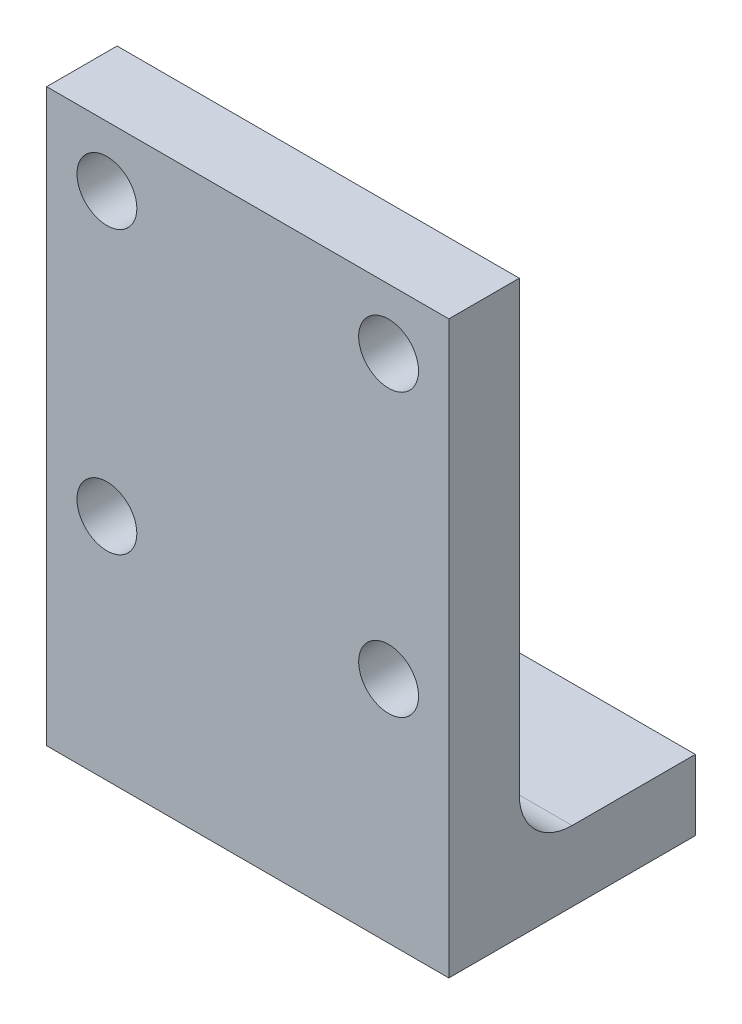
ISO-10303-21;
HEADER;
FILE_DESCRIPTION(('STEP AP214'),'2;1');
FILE_NAME('part.step','',(''),(''),'','','');
FILE_SCHEMA(('AUTOMOTIVE_DESIGN { 1 0 10303 214 1 1 1 1 }'));
ENDSEC;
DATA;
#1=APPLICATION_CONTEXT('core data for automotive mechanical design processes');
#2=APPLICATION_PROTOCOL_DEFINITION('international standard','automotive_design',2000,#1);
#3=PRODUCT_CONTEXT('',#1,'mechanical');
#4=PRODUCT('Part','Part','',(#3));
#5=PRODUCT_RELATED_PRODUCT_CATEGORY('part','',(#4));
#6=PRODUCT_DEFINITION_FORMATION('','',#4);
#7=PRODUCT_DEFINITION_CONTEXT('part definition',#1,'design');
#8=PRODUCT_DEFINITION('design','',#6,#7);
#9=PRODUCT_DEFINITION_SHAPE('','',#8);
#10=(LENGTH_UNIT() NAMED_UNIT(*) SI_UNIT(.MILLI.,.METRE.));
#11=(NAMED_UNIT(*) PLANE_ANGLE_UNIT() SI_UNIT($,.RADIAN.));
#12=(NAMED_UNIT(*) SI_UNIT($,.STERADIAN.) SOLID_ANGLE_UNIT());
#13=UNCERTAINTY_MEASURE_WITH_UNIT(LENGTH_MEASURE(1.E-05),#10,'distance_accuracy_value','');
#14=(GEOMETRIC_REPRESENTATION_CONTEXT(3) GLOBAL_UNCERTAINTY_ASSIGNED_CONTEXT((#13)) GLOBAL_UNIT_ASSIGNED_CONTEXT((#10,
#11,#12)) REPRESENTATION_CONTEXT('',''));
#15=CARTESIAN_POINT('',(0.,0.,0.));
#16=DIRECTION('',(0.,0.,1.));
#17=DIRECTION('',(1.,0.,0.));
#18=AXIS2_PLACEMENT_3D('',#15,#16,#17);
#19=CARTESIAN_POINT('',(0.,0.,0.));
#20=DIRECTION('',(0.,0.,1.));
#21=DIRECTION('',(1.,0.,0.));
#22=AXIS2_PLACEMENT_3D('',#19,#20,#21);
#23=PLANE('',#22);
#24=CARTESIAN_POINT('',(-8.,-8.00000000000001,0.));
#25=DIRECTION('',(0.,0.,1.));
#26=DIRECTION('',(1.,0.,0.));
#27=AXIS2_PLACEMENT_3D('',#24,#25,#26);
#28=CIRCLE('',#27,1.7);
#29=CARTESIAN_POINT('',(-6.3,-8.00000000000001,0.));
#30=VERTEX_POINT('',#29);
#31=EDGE_CURVE('E127',#30,#30,#28,.T.);
#32=ORIENTED_EDGE('',*,*,#31,.T.);
#33=EDGE_LOOP('',(#32));
#34=FACE_BOUND('',#33,.T.);
#35=CARTESIAN_POINT('',(8.00000000000001,-8.00000000000001,0.));
#36=DIRECTION('',(0.,0.,1.));
#37=DIRECTION('',(1.,0.,0.));
#38=AXIS2_PLACEMENT_3D('',#35,#36,#37);
#39=CIRCLE('',#38,1.7);
#40=CARTESIAN_POINT('',(9.70000000000001,-8.00000000000001,0.));
#41=VERTEX_POINT('',#40);
#42=EDGE_CURVE('E131',#41,#41,#39,.T.);
#43=ORIENTED_EDGE('',*,*,#42,.T.);
#44=EDGE_LOOP('',(#43));
#45=FACE_BOUND('',#44,.T.);
#46=CARTESIAN_POINT('',(8.,7.99999999999999,0.));
#47=DIRECTION('',(0.,0.,1.));
#48=DIRECTION('',(1.,0.,0.));
#49=AXIS2_PLACEMENT_3D('',#46,#47,#48);
#50=CIRCLE('',#49,1.7);
#51=CARTESIAN_POINT('',(9.7,7.99999999999999,0.));
#52=VERTEX_POINT('',#51);
#53=EDGE_CURVE('E137',#52,#52,#50,.T.);
#54=ORIENTED_EDGE('',*,*,#53,.T.);
#55=EDGE_LOOP('',(#54));
#56=FACE_BOUND('',#55,.T.);
#57=CARTESIAN_POINT('',(-8.,7.99999999999999,0.));
#58=DIRECTION('',(0.,0.,1.));
#59=DIRECTION('',(1.,0.,0.));
#60=AXIS2_PLACEMENT_3D('',#57,#58,#59);
#61=CIRCLE('',#60,1.7);
#62=CARTESIAN_POINT('',(-6.3,7.99999999999999,0.));
#63=VERTEX_POINT('',#62);
#64=EDGE_CURVE('E143',#63,#63,#61,.T.);
#65=ORIENTED_EDGE('',*,*,#64,.T.);
#66=EDGE_LOOP('',(#65));
#67=FACE_BOUND('',#66,.T.);
#68=DIRECTION('',(0.,1.,0.));
#69=VECTOR('',#68,1.);
#70=CARTESIAN_POINT('',(11.4218621245284,11.4218621245284,0.));
#71=LINE('',#70,#69);
#72=CARTESIAN_POINT('',(11.4218621245284,-14.,0.));
#73=VERTEX_POINT('',#72);
#74=CARTESIAN_POINT('',(11.4218621245284,11.4218621245284,0.));
#75=VERTEX_POINT('',#74);
#76=EDGE_CURVE('E149',#73,#75,#71,.T.);
#77=ORIENTED_EDGE('',*,*,#76,.F.);
#78=DIRECTION('',(1.,0.,0.));
#79=VECTOR('',#78,1.);
#80=CARTESIAN_POINT('',(-11.4218621245284,-14.,0.));
#81=LINE('',#80,#79);
#82=CARTESIAN_POINT('',(-11.4218621245284,-14.,0.));
#83=VERTEX_POINT('',#82);
#84=EDGE_CURVE('E54',#73,#83,#81,.F.);
#85=ORIENTED_EDGE('',*,*,#84,.T.);
#86=DIRECTION('',(0.,-1.,0.));
#87=VECTOR('',#86,1.);
#88=CARTESIAN_POINT('',(-11.4218621245284,11.4218621245284,0.));
#89=LINE('',#88,#87);
#90=CARTESIAN_POINT('',(-11.4218621245284,11.4218621245284,0.));
#91=VERTEX_POINT('',#90);
#92=EDGE_CURVE('E154',#91,#83,#89,.T.);
#93=ORIENTED_EDGE('',*,*,#92,.F.);
#94=DIRECTION('',(-1.,0.,0.));
#95=VECTOR('',#94,1.);
#96=CARTESIAN_POINT('',(-11.4218621245284,11.4218621245284,0.));
#97=LINE('',#96,#95);
#98=EDGE_CURVE('E160',#75,#91,#97,.T.);
#99=ORIENTED_EDGE('',*,*,#98,.F.);
#100=EDGE_LOOP('',(#77,#85,#93,#99));
#101=FACE_BOUND('',#100,.T.);
#102=ADVANCED_FACE('F33',(#34,#45,#56,#67,#101),#23,.F.);
#103=CARTESIAN_POINT('',(0.,0.,4.));
#104=DIRECTION('',(0.,0.,1.));
#105=DIRECTION('',(1.,0.,0.));
#106=AXIS2_PLACEMENT_3D('',#103,#104,#105);
#107=PLANE('',#106);
#108=CARTESIAN_POINT('',(8.00000000000001,-8.00000000000001,4.));
#109=DIRECTION('',(0.,0.,1.));
#110=DIRECTION('',(1.,0.,0.));
#111=AXIS2_PLACEMENT_3D('',#108,#109,#110);
#112=CIRCLE('',#111,1.7);
#113=CARTESIAN_POINT('',(9.70000000000001,-8.00000000000001,4.));
#114=VERTEX_POINT('',#113);
#115=EDGE_CURVE('E134',#114,#114,#112,.T.);
#116=ORIENTED_EDGE('',*,*,#115,.F.);
#117=EDGE_LOOP('',(#116));
#118=FACE_BOUND('',#117,.T.);
#119=CARTESIAN_POINT('',(-8.,7.99999999999999,4.));
#120=DIRECTION('',(0.,0.,1.));
#121=DIRECTION('',(1.,0.,0.));
#122=AXIS2_PLACEMENT_3D('',#119,#120,#121);
#123=CIRCLE('',#122,1.7);
#124=CARTESIAN_POINT('',(-6.3,7.99999999999999,4.));
#125=VERTEX_POINT('',#124);
#126=EDGE_CURVE('E146',#125,#125,#123,.T.);
#127=ORIENTED_EDGE('',*,*,#126,.F.);
#128=EDGE_LOOP('',(#127));
#129=FACE_BOUND('',#128,.T.);
#130=DIRECTION('',(0.,1.,0.));
#131=VECTOR('',#130,1.);
#132=CARTESIAN_POINT('',(11.4218621245284,11.4218621245284,4.));
#133=LINE('',#132,#131);
#134=CARTESIAN_POINT('',(11.4218621245284,-21.,4.));
#135=VERTEX_POINT('',#134);
#136=CARTESIAN_POINT('',(11.4218621245284,11.4218621245284,4.));
#137=VERTEX_POINT('',#136);
#138=EDGE_CURVE('E97',#135,#137,#133,.T.);
#139=ORIENTED_EDGE('',*,*,#138,.T.);
#140=DIRECTION('',(-1.,0.,0.));
#141=VECTOR('',#140,1.);
#142=CARTESIAN_POINT('',(-11.4218621245284,11.4218621245284,4.));
#143=LINE('',#142,#141);
#144=CARTESIAN_POINT('',(-11.4218621245284,11.4218621245284,4.));
#145=VERTEX_POINT('',#144);
#146=EDGE_CURVE('E153',#137,#145,#143,.T.);
#147=ORIENTED_EDGE('',*,*,#146,.T.);
#148=DIRECTION('',(0.,-1.,0.));
#149=VECTOR('',#148,1.);
#150=CARTESIAN_POINT('',(-11.4218621245284,11.4218621245284,4.));
#151=LINE('',#150,#149);
#152=CARTESIAN_POINT('',(-11.4218621245284,-21.,4.));
#153=VERTEX_POINT('',#152);
#154=EDGE_CURVE('E156',#145,#153,#151,.T.);
#155=ORIENTED_EDGE('',*,*,#154,.T.);
#156=DIRECTION('',(1.,0.,0.));
#157=VECTOR('',#156,1.);
#158=CARTESIAN_POINT('',(-11.4218621245284,-21.,4.));
#159=LINE('',#158,#157);
#160=EDGE_CURVE('E102',#153,#135,#159,.T.);
#161=ORIENTED_EDGE('',*,*,#160,.T.);
#162=EDGE_LOOP('',(#139,#147,#155,#161));
#163=FACE_BOUND('',#162,.T.);
#164=CARTESIAN_POINT('',(8.,7.99999999999999,4.));
#165=DIRECTION('',(0.,0.,1.));
#166=DIRECTION('',(1.,0.,0.));
#167=AXIS2_PLACEMENT_3D('',#164,#165,#166);
#168=CIRCLE('',#167,1.7);
#169=CARTESIAN_POINT('',(9.7,7.99999999999999,4.));
#170=VERTEX_POINT('',#169);
#171=EDGE_CURVE('E140',#170,#170,#168,.T.);
#172=ORIENTED_EDGE('',*,*,#171,.F.);
#173=EDGE_LOOP('',(#172));
#174=FACE_BOUND('',#173,.T.);
#175=CARTESIAN_POINT('',(-8.,-8.00000000000001,4.));
#176=DIRECTION('',(0.,0.,1.));
#177=DIRECTION('',(1.,0.,0.));
#178=AXIS2_PLACEMENT_3D('',#175,#176,#177);
#179=CIRCLE('',#178,1.7);
#180=CARTESIAN_POINT('',(-6.3,-8.00000000000001,4.));
#181=VERTEX_POINT('',#180);
#182=EDGE_CURVE('E128',#181,#181,#179,.T.);
#183=ORIENTED_EDGE('',*,*,#182,.F.);
#184=EDGE_LOOP('',(#183));
#185=FACE_BOUND('',#184,.T.);
#186=ADVANCED_FACE('F185',(#118,#129,#163,#174,#185),#107,.T.);
#187=CARTESIAN_POINT('',(11.4218621245284,11.4218621245284,4.));
#188=DIRECTION('',(-1.,0.,0.));
#189=DIRECTION('',(0.,-1.,0.));
#190=AXIS2_PLACEMENT_3D('',#187,#188,#189);
#191=PLANE('',#190);
#192=DIRECTION('',(0.,0.,-1.));
#193=VECTOR('',#192,1.);
#194=CARTESIAN_POINT('',(11.4218621245284,-21.,4.));
#195=LINE('',#194,#193);
#196=CARTESIAN_POINT('',(11.4218621245284,-21.,-10.));
#197=VERTEX_POINT('',#196);
#198=EDGE_CURVE('E90',#135,#197,#195,.T.);
#199=ORIENTED_EDGE('',*,*,#198,.T.);
#200=DIRECTION('',(0.,-1.,0.));
#201=VECTOR('',#200,1.);
#202=CARTESIAN_POINT('',(11.4218621245284,-21.,-10.));
#203=LINE('',#202,#201);
#204=CARTESIAN_POINT('',(11.4218621245284,-17.,-10.));
#205=VERTEX_POINT('',#204);
#206=EDGE_CURVE('E94',#205,#197,#203,.T.);
#207=ORIENTED_EDGE('',*,*,#206,.F.);
#208=DIRECTION('',(0.,0.,1.));
#209=VECTOR('',#208,1.);
#210=CARTESIAN_POINT('',(11.4218621245284,-17.,-10.));
#211=LINE('',#210,#209);
#212=CARTESIAN_POINT('',(11.4218621245284,-17.,-3.));
#213=VERTEX_POINT('',#212);
#214=EDGE_CURVE('E120',#205,#213,#211,.T.);
#215=ORIENTED_EDGE('',*,*,#214,.T.);
#216=CARTESIAN_POINT('',(11.4218621245284,-14.,-3.));
#217=DIRECTION('',(-1.,0.,0.));
#218=DIRECTION('',(0.,-1.,0.));
#219=AXIS2_PLACEMENT_3D('',#216,#217,#218);
#220=CIRCLE('',#219,3.);
#221=EDGE_CURVE('E41',#213,#73,#220,.T.);
#222=ORIENTED_EDGE('',*,*,#221,.T.);
#223=ORIENTED_EDGE('',*,*,#76,.T.);
#224=DIRECTION('',(0.,0.,-1.));
#225=VECTOR('',#224,1.);
#226=CARTESIAN_POINT('',(11.4218621245284,11.4218621245284,4.));
#227=LINE('',#226,#225);
#228=EDGE_CURVE('E165',#137,#75,#227,.T.);
#229=ORIENTED_EDGE('',*,*,#228,.F.);
#230=ORIENTED_EDGE('',*,*,#138,.F.);
#231=EDGE_LOOP('',(#199,#207,#215,#222,#223,#229,#230));
#232=FACE_BOUND('',#231,.T.);
#233=ADVANCED_FACE('F92',(#232),#191,.F.);
#234=CARTESIAN_POINT('',(-11.4218621245284,11.4218621245284,4.));
#235=DIRECTION('',(0.,-1.,0.));
#236=DIRECTION('',(0.,0.,-1.));
#237=AXIS2_PLACEMENT_3D('',#234,#235,#236);
#238=PLANE('',#237);
#239=ORIENTED_EDGE('',*,*,#98,.T.);
#240=DIRECTION('',(0.,0.,-1.));
#241=VECTOR('',#240,1.);
#242=CARTESIAN_POINT('',(-11.4218621245284,11.4218621245284,4.));
#243=LINE('',#242,#241);
#244=EDGE_CURVE('E158',#145,#91,#243,.T.);
#245=ORIENTED_EDGE('',*,*,#244,.F.);
#246=ORIENTED_EDGE('',*,*,#146,.F.);
#247=ORIENTED_EDGE('',*,*,#228,.T.);
#248=EDGE_LOOP('',(#239,#245,#246,#247));
#249=FACE_BOUND('',#248,.T.);
#250=ADVANCED_FACE('F183',(#249),#238,.F.);
#251=CARTESIAN_POINT('',(-11.4218621245284,11.4218621245284,4.));
#252=DIRECTION('',(1.,0.,0.));
#253=DIRECTION('',(0.,1.,0.));
#254=AXIS2_PLACEMENT_3D('',#251,#252,#253);
#255=PLANE('',#254);
#256=ORIENTED_EDGE('',*,*,#92,.T.);
#257=CARTESIAN_POINT('',(-11.4218621245284,-14.,-3.));
#258=DIRECTION('',(1.,0.,0.));
#259=DIRECTION('',(0.,1.,0.));
#260=AXIS2_PLACEMENT_3D('',#257,#258,#259);
#261=CIRCLE('',#260,3.);
#262=CARTESIAN_POINT('',(-11.4218621245284,-17.,-3.));
#263=VERTEX_POINT('',#262);
#264=EDGE_CURVE('E11',#83,#263,#261,.T.);
#265=ORIENTED_EDGE('',*,*,#264,.T.);
#266=DIRECTION('',(0.,0.,1.));
#267=VECTOR('',#266,1.);
#268=CARTESIAN_POINT('',(-11.4218621245284,-17.,-10.));
#269=LINE('',#268,#267);
#270=CARTESIAN_POINT('',(-11.4218621245284,-17.,-10.));
#271=VERTEX_POINT('',#270);
#272=EDGE_CURVE('E122',#271,#263,#269,.T.);
#273=ORIENTED_EDGE('',*,*,#272,.F.);
#274=DIRECTION('',(0.,1.,0.));
#275=VECTOR('',#274,1.);
#276=CARTESIAN_POINT('',(-11.4218621245284,-21.,-10.));
#277=LINE('',#276,#275);
#278=CARTESIAN_POINT('',(-11.4218621245284,-21.,-10.));
#279=VERTEX_POINT('',#278);
#280=EDGE_CURVE('E110',#279,#271,#277,.T.);
#281=ORIENTED_EDGE('',*,*,#280,.F.);
#282=DIRECTION('',(0.,0.,-1.));
#283=VECTOR('',#282,1.);
#284=CARTESIAN_POINT('',(-11.4218621245284,-21.,4.));
#285=LINE('',#284,#283);
#286=EDGE_CURVE('E101',#153,#279,#285,.T.);
#287=ORIENTED_EDGE('',*,*,#286,.F.);
#288=ORIENTED_EDGE('',*,*,#154,.F.);
#289=ORIENTED_EDGE('',*,*,#244,.T.);
#290=EDGE_LOOP('',(#256,#265,#273,#281,#287,#288,#289));
#291=FACE_BOUND('',#290,.T.);
#292=ADVANCED_FACE('F178',(#291),#255,.F.);
#293=CARTESIAN_POINT('',(-8.,7.99999999999999,4.));
#294=DIRECTION('',(0.,0.,-1.));
#295=DIRECTION('',(-1.,0.,0.));
#296=AXIS2_PLACEMENT_3D('',#293,#294,#295);
#297=CYLINDRICAL_SURFACE('',#296,1.7);
#298=ORIENTED_EDGE('',*,*,#126,.T.);
#299=EDGE_LOOP('',(#298));
#300=FACE_BOUND('',#299,.T.);
#301=ORIENTED_EDGE('',*,*,#64,.F.);
#302=EDGE_LOOP('',(#301));
#303=FACE_BOUND('',#302,.T.);
#304=ADVANCED_FACE('F210',(#300,#303),#297,.F.);
#305=CARTESIAN_POINT('',(8.,7.99999999999999,4.));
#306=DIRECTION('',(0.,0.,-1.));
#307=DIRECTION('',(-1.,0.,0.));
#308=AXIS2_PLACEMENT_3D('',#305,#306,#307);
#309=CYLINDRICAL_SURFACE('',#308,1.7);
#310=ORIENTED_EDGE('',*,*,#171,.T.);
#311=EDGE_LOOP('',(#310));
#312=FACE_BOUND('',#311,.T.);
#313=ORIENTED_EDGE('',*,*,#53,.F.);
#314=EDGE_LOOP('',(#313));
#315=FACE_BOUND('',#314,.T.);
#316=ADVANCED_FACE('F212',(#312,#315),#309,.F.);
#317=CARTESIAN_POINT('',(8.00000000000001,-8.00000000000001,4.));
#318=DIRECTION('',(0.,0.,-1.));
#319=DIRECTION('',(-1.,0.,0.));
#320=AXIS2_PLACEMENT_3D('',#317,#318,#319);
#321=CYLINDRICAL_SURFACE('',#320,1.7);
#322=ORIENTED_EDGE('',*,*,#115,.T.);
#323=EDGE_LOOP('',(#322));
#324=FACE_BOUND('',#323,.T.);
#325=ORIENTED_EDGE('',*,*,#42,.F.);
#326=EDGE_LOOP('',(#325));
#327=FACE_BOUND('',#326,.T.);
#328=ADVANCED_FACE('F197',(#324,#327),#321,.F.);
#329=CARTESIAN_POINT('',(-8.,-8.00000000000001,4.));
#330=DIRECTION('',(0.,0.,-1.));
#331=DIRECTION('',(-1.,0.,0.));
#332=AXIS2_PLACEMENT_3D('',#329,#330,#331);
#333=CYLINDRICAL_SURFACE('',#332,1.7);
#334=ORIENTED_EDGE('',*,*,#182,.T.);
#335=EDGE_LOOP('',(#334));
#336=FACE_BOUND('',#335,.T.);
#337=ORIENTED_EDGE('',*,*,#31,.F.);
#338=EDGE_LOOP('',(#337));
#339=FACE_BOUND('',#338,.T.);
#340=ADVANCED_FACE('F194',(#336,#339),#333,.F.);
#341=CARTESIAN_POINT('',(-11.4218621245284,-21.,4.));
#342=DIRECTION('',(0.,1.,0.));
#343=DIRECTION('',(0.,0.,1.));
#344=AXIS2_PLACEMENT_3D('',#341,#342,#343);
#345=PLANE('',#344);
#346=ORIENTED_EDGE('',*,*,#286,.T.);
#347=DIRECTION('',(-1.,0.,0.));
#348=VECTOR('',#347,1.);
#349=CARTESIAN_POINT('',(11.4218621245284,-21.,-10.));
#350=LINE('',#349,#348);
#351=EDGE_CURVE('E105',#197,#279,#350,.T.);
#352=ORIENTED_EDGE('',*,*,#351,.F.);
#353=ORIENTED_EDGE('',*,*,#198,.F.);
#354=ORIENTED_EDGE('',*,*,#160,.F.);
#355=EDGE_LOOP('',(#346,#352,#353,#354));
#356=FACE_BOUND('',#355,.T.);
#357=ADVANCED_FACE('F106',(#356),#345,.F.);
#358=CARTESIAN_POINT('',(11.4218621245284,-17.,-10.));
#359=DIRECTION('',(0.,-1.,0.));
#360=DIRECTION('',(1.,0.,0.));
#361=AXIS2_PLACEMENT_3D('',#358,#359,#360);
#362=PLANE('',#361);
#363=ORIENTED_EDGE('',*,*,#272,.T.);
#364=DIRECTION('',(1.,0.,0.));
#365=VECTOR('',#364,1.);
#366=CARTESIAN_POINT('',(11.4218621245284,-17.,-3.));
#367=LINE('',#366,#365);
#368=EDGE_CURVE('E168',#263,#213,#367,.T.);
#369=ORIENTED_EDGE('',*,*,#368,.T.);
#370=ORIENTED_EDGE('',*,*,#214,.F.);
#371=DIRECTION('',(1.,0.,0.));
#372=VECTOR('',#371,1.);
#373=CARTESIAN_POINT('',(11.4218621245284,-17.,-10.));
#374=LINE('',#373,#372);
#375=EDGE_CURVE('E114',#271,#205,#374,.T.);
#376=ORIENTED_EDGE('',*,*,#375,.F.);
#377=EDGE_LOOP('',(#363,#369,#370,#376));
#378=FACE_BOUND('',#377,.T.);
#379=ADVANCED_FACE('F173',(#378),#362,.F.);
#380=CARTESIAN_POINT('',(0.,0.,-10.));
#381=DIRECTION('',(0.,0.,1.));
#382=DIRECTION('',(1.,0.,0.));
#383=AXIS2_PLACEMENT_3D('',#380,#381,#382);
#384=PLANE('',#383);
#385=ORIENTED_EDGE('',*,*,#206,.T.);
#386=ORIENTED_EDGE('',*,*,#351,.T.);
#387=ORIENTED_EDGE('',*,*,#280,.T.);
#388=ORIENTED_EDGE('',*,*,#375,.T.);
#389=EDGE_LOOP('',(#385,#386,#387,#388));
#390=FACE_BOUND('',#389,.T.);
#391=ADVANCED_FACE('F112',(#390),#384,.F.);
#392=CARTESIAN_POINT('',(11.4218621245284,-14.,-3.));
#393=DIRECTION('',(-1.,0.,0.));
#394=DIRECTION('',(0.,-1.,0.));
#395=AXIS2_PLACEMENT_3D('',#392,#393,#394);
#396=CYLINDRICAL_SURFACE('',#395,3.);
#397=ORIENTED_EDGE('',*,*,#264,.F.);
#398=ORIENTED_EDGE('',*,*,#84,.F.);
#399=ORIENTED_EDGE('',*,*,#221,.F.);
#400=ORIENTED_EDGE('',*,*,#368,.F.);
#401=EDGE_LOOP('',(#397,#398,#399,#400));
#402=FACE_BOUND('',#401,.T.);
#403=ADVANCED_FACE('F35',(#402),#396,.F.);
#404=CLOSED_SHELL('',(#102,#186,#233,#250,#292,#304,#316,#328,#340,#357,#379,#391,#403));
#405=MANIFOLD_SOLID_BREP('B2',#404);
#406=ADVANCED_BREP_SHAPE_REPRESENTATION('',(#18,#405),#14);
#407=SHAPE_DEFINITION_REPRESENTATION(#9,#406);
ENDSEC;
END-ISO-10303-21;
